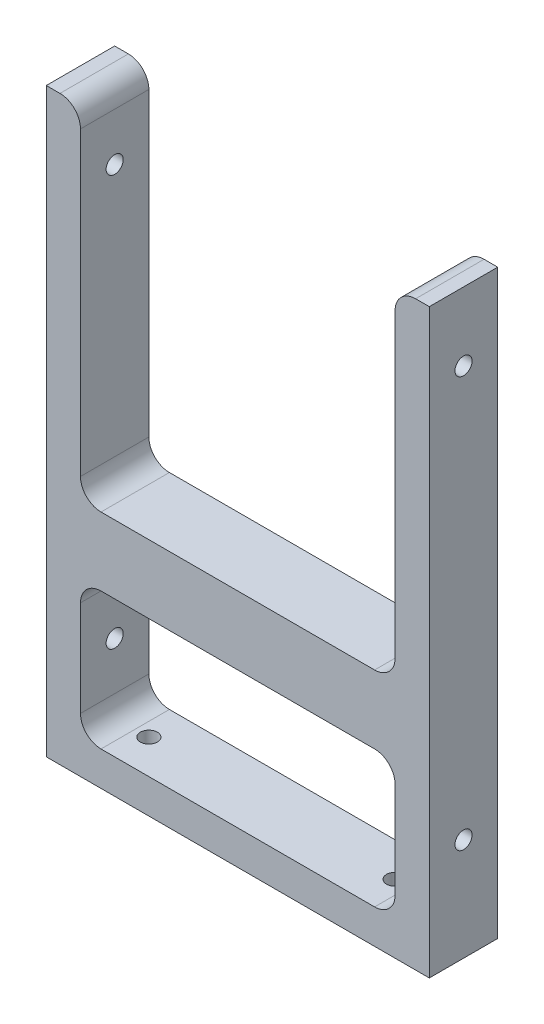
ISO-10303-21;
HEADER;
FILE_DESCRIPTION(('STEP AP214'),'2;1');
FILE_NAME('part.step','',(''),(''),'','','');
FILE_SCHEMA(('AUTOMOTIVE_DESIGN { 1 0 10303 214 1 1 1 1 }'));
ENDSEC;
DATA;
#1=APPLICATION_CONTEXT('core data for automotive mechanical design processes');
#2=APPLICATION_PROTOCOL_DEFINITION('international standard','automotive_design',2000,#1);
#3=PRODUCT_CONTEXT('',#1,'mechanical');
#4=PRODUCT('Part','Part','',(#3));
#5=PRODUCT_RELATED_PRODUCT_CATEGORY('part','',(#4));
#6=PRODUCT_DEFINITION_FORMATION('','',#4);
#7=PRODUCT_DEFINITION_CONTEXT('part definition',#1,'design');
#8=PRODUCT_DEFINITION('design','',#6,#7);
#9=PRODUCT_DEFINITION_SHAPE('','',#8);
#10=(LENGTH_UNIT() NAMED_UNIT(*) SI_UNIT(.MILLI.,.METRE.));
#11=(NAMED_UNIT(*) PLANE_ANGLE_UNIT() SI_UNIT($,.RADIAN.));
#12=(NAMED_UNIT(*) SI_UNIT($,.STERADIAN.) SOLID_ANGLE_UNIT());
#13=UNCERTAINTY_MEASURE_WITH_UNIT(LENGTH_MEASURE(1.E-05),#10,'distance_accuracy_value','');
#14=(GEOMETRIC_REPRESENTATION_CONTEXT(3) GLOBAL_UNCERTAINTY_ASSIGNED_CONTEXT((#13)) GLOBAL_UNIT_ASSIGNED_CONTEXT((#10,
#11,#12)) REPRESENTATION_CONTEXT('',''));
#15=CARTESIAN_POINT('',(0.,0.,0.));
#16=DIRECTION('',(0.,0.,1.));
#17=DIRECTION('',(1.,0.,0.));
#18=AXIS2_PLACEMENT_3D('',#15,#16,#17);
#19=CARTESIAN_POINT('',(0.,0.,10.));
#20=DIRECTION('',(0.,0.,1.));
#21=DIRECTION('',(1.,0.,0.));
#22=AXIS2_PLACEMENT_3D('',#19,#20,#21);
#23=PLANE('',#22);
#24=DIRECTION('',(-1.,0.,0.));
#25=VECTOR('',#24,1.);
#26=CARTESIAN_POINT('',(23.,42.5,10.));
#27=LINE('',#26,#25);
#28=CARTESIAN_POINT('',(28.,42.5,10.));
#29=VERTEX_POINT('',#28);
#30=CARTESIAN_POINT('',(26.,42.5,10.));
#31=VERTEX_POINT('',#30);
#32=EDGE_CURVE('E176',#29,#31,#27,.T.);
#33=ORIENTED_EDGE('',*,*,#32,.T.);
#34=CARTESIAN_POINT('',(26.,39.5,10.));
#35=DIRECTION('',(0.,0.,1.));
#36=DIRECTION('',(1.,0.,0.));
#37=AXIS2_PLACEMENT_3D('',#34,#35,#36);
#38=CIRCLE('',#37,3.);
#39=CARTESIAN_POINT('',(23.,39.5,10.));
#40=VERTEX_POINT('',#39);
#41=EDGE_CURVE('E244',#31,#40,#38,.T.);
#42=ORIENTED_EDGE('',*,*,#41,.T.);
#43=DIRECTION('',(0.,-1.,0.));
#44=VECTOR('',#43,1.);
#45=CARTESIAN_POINT('',(23.,42.5,10.));
#46=LINE('',#45,#44);
#47=CARTESIAN_POINT('',(23.,-4.5,10.));
#48=VERTEX_POINT('',#47);
#49=EDGE_CURVE('E186',#40,#48,#46,.T.);
#50=ORIENTED_EDGE('',*,*,#49,.T.);
#51=CARTESIAN_POINT('',(20.,-4.5,10.));
#52=DIRECTION('',(0.,0.,1.));
#53=DIRECTION('',(1.,0.,0.));
#54=AXIS2_PLACEMENT_3D('',#51,#52,#53);
#55=CIRCLE('',#54,3.);
#56=CARTESIAN_POINT('',(20.,-7.50000000000001,10.));
#57=VERTEX_POINT('',#56);
#58=EDGE_CURVE('E267',#48,#57,#55,.F.);
#59=ORIENTED_EDGE('',*,*,#58,.T.);
#60=DIRECTION('',(-1.,0.,0.));
#61=VECTOR('',#60,1.);
#62=CARTESIAN_POINT('',(-23.,-7.50000000000001,10.));
#63=LINE('',#62,#61);
#64=CARTESIAN_POINT('',(-20.,-7.50000000000001,10.));
#65=VERTEX_POINT('',#64);
#66=EDGE_CURVE('E295',#57,#65,#63,.T.);
#67=ORIENTED_EDGE('',*,*,#66,.T.);
#68=CARTESIAN_POINT('',(-20.,-4.5,10.));
#69=DIRECTION('',(0.,0.,1.));
#70=DIRECTION('',(1.,0.,0.));
#71=AXIS2_PLACEMENT_3D('',#68,#69,#70);
#72=CIRCLE('',#71,3.);
#73=CARTESIAN_POINT('',(-23.,-4.5,10.));
#74=VERTEX_POINT('',#73);
#75=EDGE_CURVE('E11',#65,#74,#72,.F.);
#76=ORIENTED_EDGE('',*,*,#75,.T.);
#77=DIRECTION('',(0.,1.,0.));
#78=VECTOR('',#77,1.);
#79=CARTESIAN_POINT('',(-23.,42.5,10.));
#80=LINE('',#79,#78);
#81=CARTESIAN_POINT('',(-23.,39.5,10.));
#82=VERTEX_POINT('',#81);
#83=EDGE_CURVE('E294',#74,#82,#80,.T.);
#84=ORIENTED_EDGE('',*,*,#83,.T.);
#85=CARTESIAN_POINT('',(-26.,39.5,10.));
#86=DIRECTION('',(0.,0.,1.));
#87=DIRECTION('',(1.,0.,0.));
#88=AXIS2_PLACEMENT_3D('',#85,#86,#87);
#89=CIRCLE('',#88,3.);
#90=CARTESIAN_POINT('',(-26.,42.5,10.));
#91=VERTEX_POINT('',#90);
#92=EDGE_CURVE('E53',#82,#91,#89,.T.);
#93=ORIENTED_EDGE('',*,*,#92,.T.);
#94=DIRECTION('',(-1.,0.,0.));
#95=VECTOR('',#94,1.);
#96=CARTESIAN_POINT('',(-28.,42.5,10.));
#97=LINE('',#96,#95);
#98=CARTESIAN_POINT('',(-28.,42.5,10.));
#99=VERTEX_POINT('',#98);
#100=EDGE_CURVE('E297',#91,#99,#97,.T.);
#101=ORIENTED_EDGE('',*,*,#100,.T.);
#102=DIRECTION('',(0.,-1.,0.));
#103=VECTOR('',#102,1.);
#104=CARTESIAN_POINT('',(-28.,42.5,10.));
#105=LINE('',#104,#103);
#106=CARTESIAN_POINT('',(-28.,-42.5,10.));
#107=VERTEX_POINT('',#106);
#108=EDGE_CURVE('E299',#99,#107,#105,.T.);
#109=ORIENTED_EDGE('',*,*,#108,.T.);
#110=DIRECTION('',(1.,0.,0.));
#111=VECTOR('',#110,1.);
#112=CARTESIAN_POINT('',(-28.,-42.5,10.));
#113=LINE('',#112,#111);
#114=CARTESIAN_POINT('',(28.,-42.5,10.));
#115=VERTEX_POINT('',#114);
#116=EDGE_CURVE('E192',#107,#115,#113,.T.);
#117=ORIENTED_EDGE('',*,*,#116,.T.);
#118=DIRECTION('',(0.,1.,0.));
#119=VECTOR('',#118,1.);
#120=CARTESIAN_POINT('',(28.,42.5,10.));
#121=LINE('',#120,#119);
#122=EDGE_CURVE('E187',#115,#29,#121,.T.);
#123=ORIENTED_EDGE('',*,*,#122,.T.);
#124=EDGE_LOOP('',(#33,#42,#50,#59,#67,#76,#84,#93,#101,#109,#117,#123));
#125=FACE_BOUND('',#124,.T.);
#126=DIRECTION('',(-1.,0.,0.));
#127=VECTOR('',#126,1.);
#128=CARTESIAN_POINT('',(-23.,-17.5,10.));
#129=LINE('',#128,#127);
#130=CARTESIAN_POINT('',(20.,-17.5,10.));
#131=VERTEX_POINT('',#130);
#132=CARTESIAN_POINT('',(-20.,-17.5,10.));
#133=VERTEX_POINT('',#132);
#134=EDGE_CURVE('E357',#131,#133,#129,.T.);
#135=ORIENTED_EDGE('',*,*,#134,.F.);
#136=CARTESIAN_POINT('',(20.,-20.5,10.));
#137=DIRECTION('',(0.,0.,1.));
#138=DIRECTION('',(1.,0.,0.));
#139=AXIS2_PLACEMENT_3D('',#136,#137,#138);
#140=CIRCLE('',#139,3.);
#141=CARTESIAN_POINT('',(23.,-20.5,10.));
#142=VERTEX_POINT('',#141);
#143=EDGE_CURVE('E259',#131,#142,#140,.F.);
#144=ORIENTED_EDGE('',*,*,#143,.T.);
#145=DIRECTION('',(0.,1.,0.));
#146=VECTOR('',#145,1.);
#147=CARTESIAN_POINT('',(23.,-17.5,10.));
#148=LINE('',#147,#146);
#149=CARTESIAN_POINT('',(23.,-34.5,10.));
#150=VERTEX_POINT('',#149);
#151=EDGE_CURVE('E341',#150,#142,#148,.T.);
#152=ORIENTED_EDGE('',*,*,#151,.F.);
#153=CARTESIAN_POINT('',(20.,-34.5,10.));
#154=DIRECTION('',(0.,0.,1.));
#155=DIRECTION('',(1.,0.,0.));
#156=AXIS2_PLACEMENT_3D('',#153,#154,#155);
#157=CIRCLE('',#156,3.);
#158=CARTESIAN_POINT('',(20.,-37.5,10.));
#159=VERTEX_POINT('',#158);
#160=EDGE_CURVE('E263',#150,#159,#157,.F.);
#161=ORIENTED_EDGE('',*,*,#160,.T.);
#162=DIRECTION('',(1.,0.,0.));
#163=VECTOR('',#162,1.);
#164=CARTESIAN_POINT('',(-23.,-37.5,10.));
#165=LINE('',#164,#163);
#166=CARTESIAN_POINT('',(-20.,-37.5,10.));
#167=VERTEX_POINT('',#166);
#168=EDGE_CURVE('E309',#167,#159,#165,.T.);
#169=ORIENTED_EDGE('',*,*,#168,.F.);
#170=CARTESIAN_POINT('',(-20.,-34.5,10.));
#171=DIRECTION('',(0.,0.,1.));
#172=DIRECTION('',(1.,0.,0.));
#173=AXIS2_PLACEMENT_3D('',#170,#171,#172);
#174=CIRCLE('',#173,3.);
#175=CARTESIAN_POINT('',(-23.,-34.5,10.));
#176=VERTEX_POINT('',#175);
#177=EDGE_CURVE('E271',#167,#176,#174,.F.);
#178=ORIENTED_EDGE('',*,*,#177,.T.);
#179=DIRECTION('',(0.,-1.,0.));
#180=VECTOR('',#179,1.);
#181=CARTESIAN_POINT('',(-23.,-17.5,10.));
#182=LINE('',#181,#180);
#183=CARTESIAN_POINT('',(-23.,-20.5,10.));
#184=VERTEX_POINT('',#183);
#185=EDGE_CURVE('E354',#184,#176,#182,.T.);
#186=ORIENTED_EDGE('',*,*,#185,.F.);
#187=CARTESIAN_POINT('',(-20.,-20.5,10.));
#188=DIRECTION('',(0.,0.,1.));
#189=DIRECTION('',(1.,0.,0.));
#190=AXIS2_PLACEMENT_3D('',#187,#188,#189);
#191=CIRCLE('',#190,3.);
#192=EDGE_CURVE('E255',#184,#133,#191,.F.);
#193=ORIENTED_EDGE('',*,*,#192,.T.);
#194=EDGE_LOOP('',(#135,#144,#152,#161,#169,#178,#186,#193));
#195=FACE_BOUND('',#194,.T.);
#196=ADVANCED_FACE('F37',(#125,#195),#23,.T.);
#197=CARTESIAN_POINT('',(0.,0.,0.));
#198=DIRECTION('',(0.,0.,1.));
#199=DIRECTION('',(1.,0.,0.));
#200=AXIS2_PLACEMENT_3D('',#197,#198,#199);
#201=PLANE('',#200);
#202=DIRECTION('',(0.,-1.,0.));
#203=VECTOR('',#202,1.);
#204=CARTESIAN_POINT('',(23.,42.5,0.));
#205=LINE('',#204,#203);
#206=CARTESIAN_POINT('',(23.,39.5,0.));
#207=VERTEX_POINT('',#206);
#208=CARTESIAN_POINT('',(23.,-4.5,0.));
#209=VERTEX_POINT('',#208);
#210=EDGE_CURVE('E290',#207,#209,#205,.T.);
#211=ORIENTED_EDGE('',*,*,#210,.F.);
#212=CARTESIAN_POINT('',(26.,39.5,0.));
#213=DIRECTION('',(0.,0.,1.));
#214=DIRECTION('',(1.,0.,0.));
#215=AXIS2_PLACEMENT_3D('',#212,#213,#214);
#216=CIRCLE('',#215,3.);
#217=CARTESIAN_POINT('',(26.,42.5,0.));
#218=VERTEX_POINT('',#217);
#219=EDGE_CURVE('E240',#207,#218,#216,.F.);
#220=ORIENTED_EDGE('',*,*,#219,.T.);
#221=DIRECTION('',(-1.,0.,0.));
#222=VECTOR('',#221,1.);
#223=CARTESIAN_POINT('',(23.,42.5,0.));
#224=LINE('',#223,#222);
#225=CARTESIAN_POINT('',(28.,42.5,0.));
#226=VERTEX_POINT('',#225);
#227=EDGE_CURVE('E308',#226,#218,#224,.T.);
#228=ORIENTED_EDGE('',*,*,#227,.F.);
#229=DIRECTION('',(0.,1.,0.));
#230=VECTOR('',#229,1.);
#231=CARTESIAN_POINT('',(28.,42.5,0.));
#232=LINE('',#231,#230);
#233=CARTESIAN_POINT('',(28.,-42.5,0.));
#234=VERTEX_POINT('',#233);
#235=EDGE_CURVE('E200',#234,#226,#232,.T.);
#236=ORIENTED_EDGE('',*,*,#235,.F.);
#237=DIRECTION('',(1.,0.,0.));
#238=VECTOR('',#237,1.);
#239=CARTESIAN_POINT('',(-28.,-42.5,0.));
#240=LINE('',#239,#238);
#241=CARTESIAN_POINT('',(-28.,-42.5,0.));
#242=VERTEX_POINT('',#241);
#243=EDGE_CURVE('E196',#242,#234,#240,.T.);
#244=ORIENTED_EDGE('',*,*,#243,.F.);
#245=DIRECTION('',(0.,-1.,0.));
#246=VECTOR('',#245,1.);
#247=CARTESIAN_POINT('',(-28.,42.5,0.));
#248=LINE('',#247,#246);
#249=CARTESIAN_POINT('',(-28.,42.5,0.));
#250=VERTEX_POINT('',#249);
#251=EDGE_CURVE('E316',#250,#242,#248,.T.);
#252=ORIENTED_EDGE('',*,*,#251,.F.);
#253=DIRECTION('',(-1.,0.,0.));
#254=VECTOR('',#253,1.);
#255=CARTESIAN_POINT('',(-28.,42.5,0.));
#256=LINE('',#255,#254);
#257=CARTESIAN_POINT('',(-26.,42.5,0.));
#258=VERTEX_POINT('',#257);
#259=EDGE_CURVE('E314',#258,#250,#256,.T.);
#260=ORIENTED_EDGE('',*,*,#259,.F.);
#261=CARTESIAN_POINT('',(-26.,39.5,0.));
#262=DIRECTION('',(0.,0.,1.));
#263=DIRECTION('',(1.,0.,0.));
#264=AXIS2_PLACEMENT_3D('',#261,#262,#263);
#265=CIRCLE('',#264,3.);
#266=CARTESIAN_POINT('',(-23.,39.5,0.));
#267=VERTEX_POINT('',#266);
#268=EDGE_CURVE('E238',#258,#267,#265,.F.);
#269=ORIENTED_EDGE('',*,*,#268,.T.);
#270=DIRECTION('',(0.,1.,0.));
#271=VECTOR('',#270,1.);
#272=CARTESIAN_POINT('',(-23.,42.5,0.));
#273=LINE('',#272,#271);
#274=CARTESIAN_POINT('',(-23.,-4.5,0.));
#275=VERTEX_POINT('',#274);
#276=EDGE_CURVE('E281',#275,#267,#273,.T.);
#277=ORIENTED_EDGE('',*,*,#276,.F.);
#278=CARTESIAN_POINT('',(-20.,-4.5,0.));
#279=DIRECTION('',(0.,0.,1.));
#280=DIRECTION('',(1.,0.,0.));
#281=AXIS2_PLACEMENT_3D('',#278,#279,#280);
#282=CIRCLE('',#281,3.);
#283=CARTESIAN_POINT('',(-20.,-7.50000000000001,0.));
#284=VERTEX_POINT('',#283);
#285=EDGE_CURVE('E46',#275,#284,#282,.T.);
#286=ORIENTED_EDGE('',*,*,#285,.T.);
#287=DIRECTION('',(-1.,0.,0.));
#288=VECTOR('',#287,1.);
#289=CARTESIAN_POINT('',(-23.,-7.50000000000001,0.));
#290=LINE('',#289,#288);
#291=CARTESIAN_POINT('',(20.,-7.50000000000001,0.));
#292=VERTEX_POINT('',#291);
#293=EDGE_CURVE('E280',#292,#284,#290,.T.);
#294=ORIENTED_EDGE('',*,*,#293,.F.);
#295=CARTESIAN_POINT('',(20.,-4.5,0.));
#296=DIRECTION('',(0.,0.,1.));
#297=DIRECTION('',(1.,0.,0.));
#298=AXIS2_PLACEMENT_3D('',#295,#296,#297);
#299=CIRCLE('',#298,3.);
#300=EDGE_CURVE('E265',#292,#209,#299,.T.);
#301=ORIENTED_EDGE('',*,*,#300,.T.);
#302=EDGE_LOOP('',(#211,#220,#228,#236,#244,#252,#260,#269,#277,#286,#294,#301));
#303=FACE_BOUND('',#302,.T.);
#304=DIRECTION('',(1.,0.,0.));
#305=VECTOR('',#304,1.);
#306=CARTESIAN_POINT('',(-23.,-37.5,0.));
#307=LINE('',#306,#305);
#308=CARTESIAN_POINT('',(-20.,-37.5,0.));
#309=VERTEX_POINT('',#308);
#310=CARTESIAN_POINT('',(20.,-37.5,0.));
#311=VERTEX_POINT('',#310);
#312=EDGE_CURVE('E338',#309,#311,#307,.T.);
#313=ORIENTED_EDGE('',*,*,#312,.T.);
#314=CARTESIAN_POINT('',(20.,-34.5,0.));
#315=DIRECTION('',(0.,0.,1.));
#316=DIRECTION('',(1.,0.,0.));
#317=AXIS2_PLACEMENT_3D('',#314,#315,#316);
#318=CIRCLE('',#317,3.);
#319=CARTESIAN_POINT('',(23.,-34.5,0.));
#320=VERTEX_POINT('',#319);
#321=EDGE_CURVE('E261',#311,#320,#318,.T.);
#322=ORIENTED_EDGE('',*,*,#321,.T.);
#323=DIRECTION('',(0.,1.,0.));
#324=VECTOR('',#323,1.);
#325=CARTESIAN_POINT('',(23.,-17.5,0.));
#326=LINE('',#325,#324);
#327=CARTESIAN_POINT('',(23.,-20.5,0.));
#328=VERTEX_POINT('',#327);
#329=EDGE_CURVE('E348',#320,#328,#326,.T.);
#330=ORIENTED_EDGE('',*,*,#329,.T.);
#331=CARTESIAN_POINT('',(20.,-20.5,0.));
#332=DIRECTION('',(0.,0.,1.));
#333=DIRECTION('',(1.,0.,0.));
#334=AXIS2_PLACEMENT_3D('',#331,#332,#333);
#335=CIRCLE('',#334,3.);
#336=CARTESIAN_POINT('',(20.,-17.5,0.));
#337=VERTEX_POINT('',#336);
#338=EDGE_CURVE('E257',#328,#337,#335,.T.);
#339=ORIENTED_EDGE('',*,*,#338,.T.);
#340=DIRECTION('',(-1.,0.,0.));
#341=VECTOR('',#340,1.);
#342=CARTESIAN_POINT('',(-23.,-17.5,0.));
#343=LINE('',#342,#341);
#344=CARTESIAN_POINT('',(-20.,-17.5,0.));
#345=VERTEX_POINT('',#344);
#346=EDGE_CURVE('E345',#337,#345,#343,.T.);
#347=ORIENTED_EDGE('',*,*,#346,.T.);
#348=CARTESIAN_POINT('',(-20.,-20.5,0.));
#349=DIRECTION('',(0.,0.,1.));
#350=DIRECTION('',(1.,0.,0.));
#351=AXIS2_PLACEMENT_3D('',#348,#349,#350);
#352=CIRCLE('',#351,3.);
#353=CARTESIAN_POINT('',(-23.,-20.5,0.));
#354=VERTEX_POINT('',#353);
#355=EDGE_CURVE('E253',#345,#354,#352,.T.);
#356=ORIENTED_EDGE('',*,*,#355,.T.);
#357=DIRECTION('',(0.,-1.,0.));
#358=VECTOR('',#357,1.);
#359=CARTESIAN_POINT('',(-23.,-17.5,0.));
#360=LINE('',#359,#358);
#361=CARTESIAN_POINT('',(-23.,-34.5,0.));
#362=VERTEX_POINT('',#361);
#363=EDGE_CURVE('E342',#354,#362,#360,.T.);
#364=ORIENTED_EDGE('',*,*,#363,.T.);
#365=CARTESIAN_POINT('',(-20.,-34.5,0.));
#366=DIRECTION('',(0.,0.,1.));
#367=DIRECTION('',(1.,0.,0.));
#368=AXIS2_PLACEMENT_3D('',#365,#366,#367);
#369=CIRCLE('',#368,3.);
#370=EDGE_CURVE('E269',#362,#309,#369,.T.);
#371=ORIENTED_EDGE('',*,*,#370,.T.);
#372=EDGE_LOOP('',(#313,#322,#330,#339,#347,#356,#364,#371));
#373=FACE_BOUND('',#372,.T.);
#374=ADVANCED_FACE('F278',(#303,#373),#201,.F.);
#375=CARTESIAN_POINT('',(28.,42.5,10.));
#376=DIRECTION('',(-1.,0.,0.));
#377=DIRECTION('',(0.,0.,1.));
#378=AXIS2_PLACEMENT_3D('',#375,#376,#377);
#379=PLANE('',#378);
#380=CARTESIAN_POINT('',(28.,32.5,5.00000000000001));
#381=DIRECTION('',(1.,0.,0.));
#382=DIRECTION('',(0.,0.,-1.));
#383=AXIS2_PLACEMENT_3D('',#380,#381,#382);
#384=CIRCLE('',#383,1.24999999999999);
#385=CARTESIAN_POINT('',(28.,32.5,3.75000000000002));
#386=VERTEX_POINT('',#385);
#387=EDGE_CURVE('E391',#386,#386,#384,.T.);
#388=ORIENTED_EDGE('',*,*,#387,.F.);
#389=EDGE_LOOP('',(#388));
#390=FACE_BOUND('',#389,.T.);
#391=CARTESIAN_POINT('',(28.,-27.5,5.));
#392=DIRECTION('',(1.,0.,0.));
#393=DIRECTION('',(0.,0.,-1.));
#394=AXIS2_PLACEMENT_3D('',#391,#392,#393);
#395=CIRCLE('',#394,1.24999999999999);
#396=CARTESIAN_POINT('',(28.,-27.5,3.75000000000001));
#397=VERTEX_POINT('',#396);
#398=EDGE_CURVE('E379',#397,#397,#395,.T.);
#399=ORIENTED_EDGE('',*,*,#398,.F.);
#400=EDGE_LOOP('',(#399));
#401=FACE_BOUND('',#400,.T.);
#402=ORIENTED_EDGE('',*,*,#235,.T.);
#403=DIRECTION('',(0.,0.,-1.));
#404=VECTOR('',#403,1.);
#405=CARTESIAN_POINT('',(28.,42.5,10.));
#406=LINE('',#405,#404);
#407=EDGE_CURVE('E181',#29,#226,#406,.T.);
#408=ORIENTED_EDGE('',*,*,#407,.F.);
#409=ORIENTED_EDGE('',*,*,#122,.F.);
#410=DIRECTION('',(0.,0.,-1.));
#411=VECTOR('',#410,1.);
#412=CARTESIAN_POINT('',(28.,-42.5,10.));
#413=LINE('',#412,#411);
#414=EDGE_CURVE('E306',#115,#234,#413,.T.);
#415=ORIENTED_EDGE('',*,*,#414,.T.);
#416=EDGE_LOOP('',(#402,#408,#409,#415));
#417=FACE_BOUND('',#416,.T.);
#418=ADVANCED_FACE('F198',(#390,#401,#417),#379,.F.);
#419=CARTESIAN_POINT('',(23.,42.5,10.));
#420=DIRECTION('',(0.,-1.,0.));
#421=DIRECTION('',(0.,0.,-1.));
#422=AXIS2_PLACEMENT_3D('',#419,#420,#421);
#423=PLANE('',#422);
#424=ORIENTED_EDGE('',*,*,#227,.T.);
#425=DIRECTION('',(0.,0.,-1.));
#426=VECTOR('',#425,1.);
#427=CARTESIAN_POINT('',(26.,42.5,10.));
#428=LINE('',#427,#426);
#429=EDGE_CURVE('E184',#218,#31,#428,.F.);
#430=ORIENTED_EDGE('',*,*,#429,.T.);
#431=ORIENTED_EDGE('',*,*,#32,.F.);
#432=ORIENTED_EDGE('',*,*,#407,.T.);
#433=EDGE_LOOP('',(#424,#430,#431,#432));
#434=FACE_BOUND('',#433,.T.);
#435=ADVANCED_FACE('F179',(#434),#423,.F.);
#436=CARTESIAN_POINT('',(23.,42.5,10.));
#437=DIRECTION('',(1.,0.,0.));
#438=DIRECTION('',(0.,1.,0.));
#439=AXIS2_PLACEMENT_3D('',#436,#437,#438);
#440=PLANE('',#439);
#441=CARTESIAN_POINT('',(23.,32.5,5.00000000000001));
#442=DIRECTION('',(1.,0.,0.));
#443=DIRECTION('',(0.,1.,0.));
#444=AXIS2_PLACEMENT_3D('',#441,#442,#443);
#445=CIRCLE('',#444,1.24999999999999);
#446=CARTESIAN_POINT('',(23.,33.75,5.00000000000001));
#447=VERTEX_POINT('',#446);
#448=EDGE_CURVE('E382',#447,#447,#445,.T.);
#449=ORIENTED_EDGE('',*,*,#448,.T.);
#450=EDGE_LOOP('',(#449));
#451=FACE_BOUND('',#450,.T.);
#452=ORIENTED_EDGE('',*,*,#210,.T.);
#453=DIRECTION('',(0.,0.,-1.));
#454=VECTOR('',#453,1.);
#455=CARTESIAN_POINT('',(23.,-4.5,10.));
#456=LINE('',#455,#454);
#457=EDGE_CURVE('E236',#209,#48,#456,.F.);
#458=ORIENTED_EDGE('',*,*,#457,.T.);
#459=ORIENTED_EDGE('',*,*,#49,.F.);
#460=DIRECTION('',(0.,0.,-1.));
#461=VECTOR('',#460,1.);
#462=CARTESIAN_POINT('',(23.,39.5,10.));
#463=LINE('',#462,#461);
#464=EDGE_CURVE('E233',#40,#207,#463,.T.);
#465=ORIENTED_EDGE('',*,*,#464,.T.);
#466=EDGE_LOOP('',(#452,#458,#459,#465));
#467=FACE_BOUND('',#466,.T.);
#468=ADVANCED_FACE('F335',(#451,#467),#440,.F.);
#469=CARTESIAN_POINT('',(-23.,-7.50000000000001,10.));
#470=DIRECTION('',(0.,-1.,0.));
#471=DIRECTION('',(0.,0.,-1.));
#472=AXIS2_PLACEMENT_3D('',#469,#470,#471);
#473=PLANE('',#472);
#474=ORIENTED_EDGE('',*,*,#66,.F.);
#475=DIRECTION('',(0.,0.,-1.));
#476=VECTOR('',#475,1.);
#477=CARTESIAN_POINT('',(20.,-7.50000000000001,0.));
#478=LINE('',#477,#476);
#479=EDGE_CURVE('E230',#57,#292,#478,.T.);
#480=ORIENTED_EDGE('',*,*,#479,.T.);
#481=ORIENTED_EDGE('',*,*,#293,.T.);
#482=DIRECTION('',(0.,0.,-1.));
#483=VECTOR('',#482,1.);
#484=CARTESIAN_POINT('',(-20.,-7.50000000000001,10.));
#485=LINE('',#484,#483);
#486=EDGE_CURVE('E228',#284,#65,#485,.F.);
#487=ORIENTED_EDGE('',*,*,#486,.T.);
#488=EDGE_LOOP('',(#474,#480,#481,#487));
#489=FACE_BOUND('',#488,.T.);
#490=ADVANCED_FACE('F287',(#489),#473,.F.);
#491=CARTESIAN_POINT('',(-23.,42.5,10.));
#492=DIRECTION('',(-1.,0.,0.));
#493=DIRECTION('',(0.,-1.,0.));
#494=AXIS2_PLACEMENT_3D('',#491,#492,#493);
#495=PLANE('',#494);
#496=CARTESIAN_POINT('',(-23.,32.5,5.00000000000001));
#497=DIRECTION('',(-1.,0.,0.));
#498=DIRECTION('',(0.,-1.,0.));
#499=AXIS2_PLACEMENT_3D('',#496,#497,#498);
#500=CIRCLE('',#499,1.24999999999999);
#501=CARTESIAN_POINT('',(-23.,31.25,5.00000000000001));
#502=VERTEX_POINT('',#501);
#503=EDGE_CURVE('E385',#502,#502,#500,.T.);
#504=ORIENTED_EDGE('',*,*,#503,.T.);
#505=EDGE_LOOP('',(#504));
#506=FACE_BOUND('',#505,.T.);
#507=ORIENTED_EDGE('',*,*,#83,.F.);
#508=DIRECTION('',(0.,0.,-1.));
#509=VECTOR('',#508,1.);
#510=CARTESIAN_POINT('',(-23.,-4.5,0.));
#511=LINE('',#510,#509);
#512=EDGE_CURVE('E247',#74,#275,#511,.T.);
#513=ORIENTED_EDGE('',*,*,#512,.T.);
#514=ORIENTED_EDGE('',*,*,#276,.T.);
#515=DIRECTION('',(0.,0.,-1.));
#516=VECTOR('',#515,1.);
#517=CARTESIAN_POINT('',(-23.,39.5,10.));
#518=LINE('',#517,#516);
#519=EDGE_CURVE('E61',#267,#82,#518,.F.);
#520=ORIENTED_EDGE('',*,*,#519,.T.);
#521=EDGE_LOOP('',(#507,#513,#514,#520));
#522=FACE_BOUND('',#521,.T.);
#523=ADVANCED_FACE('F296',(#506,#522),#495,.F.);
#524=CARTESIAN_POINT('',(-28.,42.5,10.));
#525=DIRECTION('',(0.,-1.,0.));
#526=DIRECTION('',(0.,0.,-1.));
#527=AXIS2_PLACEMENT_3D('',#524,#525,#526);
#528=PLANE('',#527);
#529=ORIENTED_EDGE('',*,*,#100,.F.);
#530=DIRECTION('',(0.,0.,-1.));
#531=VECTOR('',#530,1.);
#532=CARTESIAN_POINT('',(-26.,42.5,10.));
#533=LINE('',#532,#531);
#534=EDGE_CURVE('E250',#91,#258,#533,.T.);
#535=ORIENTED_EDGE('',*,*,#534,.T.);
#536=ORIENTED_EDGE('',*,*,#259,.T.);
#537=DIRECTION('',(0.,0.,-1.));
#538=VECTOR('',#537,1.);
#539=CARTESIAN_POINT('',(-28.,42.5,10.));
#540=LINE('',#539,#538);
#541=EDGE_CURVE('E202',#99,#250,#540,.T.);
#542=ORIENTED_EDGE('',*,*,#541,.F.);
#543=EDGE_LOOP('',(#529,#535,#536,#542));
#544=FACE_BOUND('',#543,.T.);
#545=ADVANCED_FACE('F434',(#544),#528,.F.);
#546=CARTESIAN_POINT('',(-28.,42.5,10.));
#547=DIRECTION('',(1.,0.,0.));
#548=DIRECTION('',(0.,0.,-1.));
#549=AXIS2_PLACEMENT_3D('',#546,#547,#548);
#550=PLANE('',#549);
#551=CARTESIAN_POINT('',(-28.,32.5,5.00000000000001));
#552=DIRECTION('',(1.,0.,0.));
#553=DIRECTION('',(0.,0.,-1.));
#554=AXIS2_PLACEMENT_3D('',#551,#552,#553);
#555=CIRCLE('',#554,1.24999999999999);
#556=CARTESIAN_POINT('',(-28.,32.5,3.75000000000002));
#557=VERTEX_POINT('',#556);
#558=EDGE_CURVE('E388',#557,#557,#555,.T.);
#559=ORIENTED_EDGE('',*,*,#558,.T.);
#560=EDGE_LOOP('',(#559));
#561=FACE_BOUND('',#560,.T.);
#562=CARTESIAN_POINT('',(-28.,-27.5,5.));
#563=DIRECTION('',(1.,0.,0.));
#564=DIRECTION('',(0.,0.,-1.));
#565=AXIS2_PLACEMENT_3D('',#562,#563,#564);
#566=CIRCLE('',#565,1.24999999999999);
#567=CARTESIAN_POINT('',(-28.,-27.5,3.75000000000001));
#568=VERTEX_POINT('',#567);
#569=EDGE_CURVE('E376',#568,#568,#566,.T.);
#570=ORIENTED_EDGE('',*,*,#569,.T.);
#571=EDGE_LOOP('',(#570));
#572=FACE_BOUND('',#571,.T.);
#573=ORIENTED_EDGE('',*,*,#251,.T.);
#574=DIRECTION('',(0.,0.,-1.));
#575=VECTOR('',#574,1.);
#576=CARTESIAN_POINT('',(-28.,-42.5,10.));
#577=LINE('',#576,#575);
#578=EDGE_CURVE('E207',#107,#242,#577,.T.);
#579=ORIENTED_EDGE('',*,*,#578,.F.);
#580=ORIENTED_EDGE('',*,*,#108,.F.);
#581=ORIENTED_EDGE('',*,*,#541,.T.);
#582=EDGE_LOOP('',(#573,#579,#580,#581));
#583=FACE_BOUND('',#582,.T.);
#584=ADVANCED_FACE('F430',(#561,#572,#583),#550,.F.);
#585=CARTESIAN_POINT('',(-28.,-42.5,10.));
#586=DIRECTION('',(0.,1.,0.));
#587=DIRECTION('',(0.,0.,1.));
#588=AXIS2_PLACEMENT_3D('',#585,#586,#587);
#589=PLANE('',#588);
#590=CARTESIAN_POINT('',(-18.,-42.5,5.));
#591=DIRECTION('',(0.,-1.,0.));
#592=DIRECTION('',(0.,0.,-1.));
#593=AXIS2_PLACEMENT_3D('',#590,#591,#592);
#594=CIRCLE('',#593,1.24999999999999);
#595=CARTESIAN_POINT('',(-18.,-42.5,3.75000000000001));
#596=VERTEX_POINT('',#595);
#597=EDGE_CURVE('E370',#596,#596,#594,.T.);
#598=ORIENTED_EDGE('',*,*,#597,.F.);
#599=EDGE_LOOP('',(#598));
#600=FACE_BOUND('',#599,.T.);
#601=CARTESIAN_POINT('',(18.,-42.5,5.));
#602=DIRECTION('',(0.,-1.,0.));
#603=DIRECTION('',(0.,0.,-1.));
#604=AXIS2_PLACEMENT_3D('',#601,#602,#603);
#605=CIRCLE('',#604,1.24999999999999);
#606=CARTESIAN_POINT('',(18.,-42.5,3.75000000000001));
#607=VERTEX_POINT('',#606);
#608=EDGE_CURVE('E364',#607,#607,#605,.T.);
#609=ORIENTED_EDGE('',*,*,#608,.F.);
#610=EDGE_LOOP('',(#609));
#611=FACE_BOUND('',#610,.T.);
#612=ORIENTED_EDGE('',*,*,#243,.T.);
#613=ORIENTED_EDGE('',*,*,#414,.F.);
#614=ORIENTED_EDGE('',*,*,#116,.F.);
#615=ORIENTED_EDGE('',*,*,#578,.T.);
#616=EDGE_LOOP('',(#612,#613,#614,#615));
#617=FACE_BOUND('',#616,.T.);
#618=ADVANCED_FACE('F323',(#600,#611,#617),#589,.F.);
#619=CARTESIAN_POINT('',(23.,-17.5,10.));
#620=DIRECTION('',(-1.,0.,0.));
#621=DIRECTION('',(0.,0.,1.));
#622=AXIS2_PLACEMENT_3D('',#619,#620,#621);
#623=PLANE('',#622);
#624=CARTESIAN_POINT('',(23.,-27.5,5.));
#625=DIRECTION('',(-1.,0.,0.));
#626=DIRECTION('',(0.,0.,1.));
#627=AXIS2_PLACEMENT_3D('',#624,#625,#626);
#628=CIRCLE('',#627,1.24999999999999);
#629=CARTESIAN_POINT('',(23.,-27.5,6.24999999999999));
#630=VERTEX_POINT('',#629);
#631=EDGE_CURVE('E373',#630,#630,#628,.T.);
#632=ORIENTED_EDGE('',*,*,#631,.F.);
#633=EDGE_LOOP('',(#632));
#634=FACE_BOUND('',#633,.T.);
#635=ORIENTED_EDGE('',*,*,#151,.T.);
#636=DIRECTION('',(0.,0.,-1.));
#637=VECTOR('',#636,1.);
#638=CARTESIAN_POINT('',(23.,-20.5,0.));
#639=LINE('',#638,#637);
#640=EDGE_CURVE('E220',#142,#328,#639,.T.);
#641=ORIENTED_EDGE('',*,*,#640,.T.);
#642=ORIENTED_EDGE('',*,*,#329,.F.);
#643=DIRECTION('',(0.,0.,-1.));
#644=VECTOR('',#643,1.);
#645=CARTESIAN_POINT('',(23.,-34.5,10.));
#646=LINE('',#645,#644);
#647=EDGE_CURVE('E218',#320,#150,#646,.F.);
#648=ORIENTED_EDGE('',*,*,#647,.T.);
#649=EDGE_LOOP('',(#635,#641,#642,#648));
#650=FACE_BOUND('',#649,.T.);
#651=ADVANCED_FACE('F425',(#634,#650),#623,.T.);
#652=CARTESIAN_POINT('',(-23.,-17.5,10.));
#653=DIRECTION('',(0.,-1.,0.));
#654=DIRECTION('',(0.,0.,-1.));
#655=AXIS2_PLACEMENT_3D('',#652,#653,#654);
#656=PLANE('',#655);
#657=ORIENTED_EDGE('',*,*,#134,.T.);
#658=DIRECTION('',(0.,0.,-1.));
#659=VECTOR('',#658,1.);
#660=CARTESIAN_POINT('',(-20.,-17.5,0.));
#661=LINE('',#660,#659);
#662=EDGE_CURVE('E204',#133,#345,#661,.T.);
#663=ORIENTED_EDGE('',*,*,#662,.T.);
#664=ORIENTED_EDGE('',*,*,#346,.F.);
#665=DIRECTION('',(0.,0.,-1.));
#666=VECTOR('',#665,1.);
#667=CARTESIAN_POINT('',(20.,-17.5,10.));
#668=LINE('',#667,#666);
#669=EDGE_CURVE('E201',#337,#131,#668,.F.);
#670=ORIENTED_EDGE('',*,*,#669,.T.);
#671=EDGE_LOOP('',(#657,#663,#664,#670));
#672=FACE_BOUND('',#671,.T.);
#673=ADVANCED_FACE('F495',(#672),#656,.T.);
#674=CARTESIAN_POINT('',(-23.,-17.5,10.));
#675=DIRECTION('',(1.,0.,0.));
#676=DIRECTION('',(0.,0.,-1.));
#677=AXIS2_PLACEMENT_3D('',#674,#675,#676);
#678=PLANE('',#677);
#679=CARTESIAN_POINT('',(-23.,-27.5,5.));
#680=DIRECTION('',(1.,0.,0.));
#681=DIRECTION('',(0.,0.,-1.));
#682=AXIS2_PLACEMENT_3D('',#679,#680,#681);
#683=CIRCLE('',#682,1.24999999999999);
#684=CARTESIAN_POINT('',(-23.,-27.5,3.75000000000001));
#685=VERTEX_POINT('',#684);
#686=EDGE_CURVE('E41',#685,#685,#683,.T.);
#687=ORIENTED_EDGE('',*,*,#686,.F.);
#688=EDGE_LOOP('',(#687));
#689=FACE_BOUND('',#688,.T.);
#690=ORIENTED_EDGE('',*,*,#363,.F.);
#691=DIRECTION('',(0.,0.,-1.));
#692=VECTOR('',#691,1.);
#693=CARTESIAN_POINT('',(-23.,-20.5,10.));
#694=LINE('',#693,#692);
#695=EDGE_CURVE('E216',#354,#184,#694,.F.);
#696=ORIENTED_EDGE('',*,*,#695,.T.);
#697=ORIENTED_EDGE('',*,*,#185,.T.);
#698=DIRECTION('',(0.,0.,-1.));
#699=VECTOR('',#698,1.);
#700=CARTESIAN_POINT('',(-23.,-34.5,0.));
#701=LINE('',#700,#699);
#702=EDGE_CURVE('E213',#176,#362,#701,.T.);
#703=ORIENTED_EDGE('',*,*,#702,.T.);
#704=EDGE_LOOP('',(#690,#696,#697,#703));
#705=FACE_BOUND('',#704,.T.);
#706=ADVANCED_FACE('F492',(#689,#705),#678,.T.);
#707=CARTESIAN_POINT('',(-23.,-37.5,10.));
#708=DIRECTION('',(0.,1.,0.));
#709=DIRECTION('',(0.,0.,1.));
#710=AXIS2_PLACEMENT_3D('',#707,#708,#709);
#711=PLANE('',#710);
#712=CARTESIAN_POINT('',(-18.,-37.5,5.));
#713=DIRECTION('',(0.,1.,0.));
#714=DIRECTION('',(0.,0.,1.));
#715=AXIS2_PLACEMENT_3D('',#712,#713,#714);
#716=CIRCLE('',#715,1.24999999999999);
#717=CARTESIAN_POINT('',(-18.,-37.5,6.24999999999999));
#718=VERTEX_POINT('',#717);
#719=EDGE_CURVE('E367',#718,#718,#716,.T.);
#720=ORIENTED_EDGE('',*,*,#719,.F.);
#721=EDGE_LOOP('',(#720));
#722=FACE_BOUND('',#721,.T.);
#723=CARTESIAN_POINT('',(18.,-37.5,5.));
#724=DIRECTION('',(0.,1.,0.));
#725=DIRECTION('',(0.,0.,1.));
#726=AXIS2_PLACEMENT_3D('',#723,#724,#725);
#727=CIRCLE('',#726,1.24999999999999);
#728=CARTESIAN_POINT('',(18.,-37.5,6.24999999999999));
#729=VERTEX_POINT('',#728);
#730=EDGE_CURVE('E351',#729,#729,#727,.T.);
#731=ORIENTED_EDGE('',*,*,#730,.F.);
#732=EDGE_LOOP('',(#731));
#733=FACE_BOUND('',#732,.T.);
#734=ORIENTED_EDGE('',*,*,#168,.T.);
#735=DIRECTION('',(0.,0.,-1.));
#736=VECTOR('',#735,1.);
#737=CARTESIAN_POINT('',(20.,-37.5,0.));
#738=LINE('',#737,#736);
#739=EDGE_CURVE('E225',#159,#311,#738,.T.);
#740=ORIENTED_EDGE('',*,*,#739,.T.);
#741=ORIENTED_EDGE('',*,*,#312,.F.);
#742=DIRECTION('',(0.,0.,-1.));
#743=VECTOR('',#742,1.);
#744=CARTESIAN_POINT('',(-20.,-37.5,10.));
#745=LINE('',#744,#743);
#746=EDGE_CURVE('E223',#309,#167,#745,.F.);
#747=ORIENTED_EDGE('',*,*,#746,.T.);
#748=EDGE_LOOP('',(#734,#740,#741,#747));
#749=FACE_BOUND('',#748,.T.);
#750=ADVANCED_FACE('F453',(#722,#733,#749),#711,.T.);
#751=CARTESIAN_POINT('',(-20.,-20.5,10.));
#752=DIRECTION('',(0.,0.,1.));
#753=DIRECTION('',(1.,0.,0.));
#754=AXIS2_PLACEMENT_3D('',#751,#752,#753);
#755=CYLINDRICAL_SURFACE('',#754,3.);
#756=ORIENTED_EDGE('',*,*,#192,.F.);
#757=ORIENTED_EDGE('',*,*,#695,.F.);
#758=ORIENTED_EDGE('',*,*,#355,.F.);
#759=ORIENTED_EDGE('',*,*,#662,.F.);
#760=EDGE_LOOP('',(#756,#757,#758,#759));
#761=FACE_BOUND('',#760,.T.);
#762=ADVANCED_FACE('F449',(#761),#755,.F.);
#763=CARTESIAN_POINT('',(20.,-20.5,10.));
#764=DIRECTION('',(0.,0.,1.));
#765=DIRECTION('',(1.,0.,0.));
#766=AXIS2_PLACEMENT_3D('',#763,#764,#765);
#767=CYLINDRICAL_SURFACE('',#766,3.);
#768=ORIENTED_EDGE('',*,*,#143,.F.);
#769=ORIENTED_EDGE('',*,*,#669,.F.);
#770=ORIENTED_EDGE('',*,*,#338,.F.);
#771=ORIENTED_EDGE('',*,*,#640,.F.);
#772=EDGE_LOOP('',(#768,#769,#770,#771));
#773=FACE_BOUND('',#772,.T.);
#774=ADVANCED_FACE('F452',(#773),#767,.F.);
#775=CARTESIAN_POINT('',(20.,-34.5,10.));
#776=DIRECTION('',(0.,0.,1.));
#777=DIRECTION('',(1.,0.,0.));
#778=AXIS2_PLACEMENT_3D('',#775,#776,#777);
#779=CYLINDRICAL_SURFACE('',#778,3.);
#780=ORIENTED_EDGE('',*,*,#160,.F.);
#781=ORIENTED_EDGE('',*,*,#647,.F.);
#782=ORIENTED_EDGE('',*,*,#321,.F.);
#783=ORIENTED_EDGE('',*,*,#739,.F.);
#784=EDGE_LOOP('',(#780,#781,#782,#783));
#785=FACE_BOUND('',#784,.T.);
#786=ADVANCED_FACE('F457',(#785),#779,.F.);
#787=CARTESIAN_POINT('',(20.,-4.5,10.));
#788=DIRECTION('',(0.,0.,1.));
#789=DIRECTION('',(1.,0.,0.));
#790=AXIS2_PLACEMENT_3D('',#787,#788,#789);
#791=CYLINDRICAL_SURFACE('',#790,3.);
#792=ORIENTED_EDGE('',*,*,#58,.F.);
#793=ORIENTED_EDGE('',*,*,#457,.F.);
#794=ORIENTED_EDGE('',*,*,#300,.F.);
#795=ORIENTED_EDGE('',*,*,#479,.F.);
#796=EDGE_LOOP('',(#792,#793,#794,#795));
#797=FACE_BOUND('',#796,.T.);
#798=ADVANCED_FACE('F461',(#797),#791,.F.);
#799=CARTESIAN_POINT('',(26.,39.5,10.));
#800=DIRECTION('',(0.,0.,-1.));
#801=DIRECTION('',(-1.,0.,0.));
#802=AXIS2_PLACEMENT_3D('',#799,#800,#801);
#803=CYLINDRICAL_SURFACE('',#802,3.);
#804=ORIENTED_EDGE('',*,*,#41,.F.);
#805=ORIENTED_EDGE('',*,*,#429,.F.);
#806=ORIENTED_EDGE('',*,*,#219,.F.);
#807=ORIENTED_EDGE('',*,*,#464,.F.);
#808=EDGE_LOOP('',(#804,#805,#806,#807));
#809=FACE_BOUND('',#808,.T.);
#810=ADVANCED_FACE('F329',(#809),#803,.T.);
#811=CARTESIAN_POINT('',(-20.,-34.5,10.));
#812=DIRECTION('',(0.,0.,1.));
#813=DIRECTION('',(1.,0.,0.));
#814=AXIS2_PLACEMENT_3D('',#811,#812,#813);
#815=CYLINDRICAL_SURFACE('',#814,3.);
#816=ORIENTED_EDGE('',*,*,#177,.F.);
#817=ORIENTED_EDGE('',*,*,#746,.F.);
#818=ORIENTED_EDGE('',*,*,#370,.F.);
#819=ORIENTED_EDGE('',*,*,#702,.F.);
#820=EDGE_LOOP('',(#816,#817,#818,#819));
#821=FACE_BOUND('',#820,.T.);
#822=ADVANCED_FACE('F468',(#821),#815,.F.);
#823=CARTESIAN_POINT('',(-20.,-4.5,10.));
#824=DIRECTION('',(0.,0.,1.));
#825=DIRECTION('',(1.,0.,0.));
#826=AXIS2_PLACEMENT_3D('',#823,#824,#825);
#827=CYLINDRICAL_SURFACE('',#826,3.);
#828=ORIENTED_EDGE('',*,*,#75,.F.);
#829=ORIENTED_EDGE('',*,*,#486,.F.);
#830=ORIENTED_EDGE('',*,*,#285,.F.);
#831=ORIENTED_EDGE('',*,*,#512,.F.);
#832=EDGE_LOOP('',(#828,#829,#830,#831));
#833=FACE_BOUND('',#832,.T.);
#834=ADVANCED_FACE('F293',(#833),#827,.F.);
#835=CARTESIAN_POINT('',(-26.,39.5,10.));
#836=DIRECTION('',(0.,0.,-1.));
#837=DIRECTION('',(-1.,0.,0.));
#838=AXIS2_PLACEMENT_3D('',#835,#836,#837);
#839=CYLINDRICAL_SURFACE('',#838,3.);
#840=ORIENTED_EDGE('',*,*,#92,.F.);
#841=ORIENTED_EDGE('',*,*,#519,.F.);
#842=ORIENTED_EDGE('',*,*,#268,.F.);
#843=ORIENTED_EDGE('',*,*,#534,.F.);
#844=EDGE_LOOP('',(#840,#841,#842,#843));
#845=FACE_BOUND('',#844,.T.);
#846=ADVANCED_FACE('F39',(#845),#839,.T.);
#847=CARTESIAN_POINT('',(18.,-42.5,5.));
#848=DIRECTION('',(0.,-1.,0.));
#849=DIRECTION('',(0.,0.,-1.));
#850=AXIS2_PLACEMENT_3D('',#847,#848,#849);
#851=CYLINDRICAL_SURFACE('',#850,1.24999999999999);
#852=ORIENTED_EDGE('',*,*,#608,.T.);
#853=EDGE_LOOP('',(#852));
#854=FACE_BOUND('',#853,.T.);
#855=ORIENTED_EDGE('',*,*,#730,.T.);
#856=EDGE_LOOP('',(#855));
#857=FACE_BOUND('',#856,.T.);
#858=ADVANCED_FACE('F475',(#854,#857),#851,.F.);
#859=CARTESIAN_POINT('',(-18.,-42.5,5.));
#860=DIRECTION('',(0.,-1.,0.));
#861=DIRECTION('',(0.,0.,-1.));
#862=AXIS2_PLACEMENT_3D('',#859,#860,#861);
#863=CYLINDRICAL_SURFACE('',#862,1.24999999999999);
#864=ORIENTED_EDGE('',*,*,#597,.T.);
#865=EDGE_LOOP('',(#864));
#866=FACE_BOUND('',#865,.T.);
#867=ORIENTED_EDGE('',*,*,#719,.T.);
#868=EDGE_LOOP('',(#867));
#869=FACE_BOUND('',#868,.T.);
#870=ADVANCED_FACE('F415',(#866,#869),#863,.F.);
#871=CARTESIAN_POINT('',(28.,-27.5,5.));
#872=DIRECTION('',(1.,0.,0.));
#873=DIRECTION('',(0.,0.,-1.));
#874=AXIS2_PLACEMENT_3D('',#871,#872,#873);
#875=CYLINDRICAL_SURFACE('',#874,1.24999999999999);
#876=ORIENTED_EDGE('',*,*,#686,.T.);
#877=EDGE_LOOP('',(#876));
#878=FACE_BOUND('',#877,.T.);
#879=ORIENTED_EDGE('',*,*,#569,.F.);
#880=EDGE_LOOP('',(#879));
#881=FACE_BOUND('',#880,.T.);
#882=ADVANCED_FACE('F406',(#878,#881),#875,.F.);
#883=ORIENTED_EDGE('',*,*,#631,.T.);
#884=EDGE_LOOP('',(#883));
#885=FACE_BOUND('',#884,.T.);
#886=ORIENTED_EDGE('',*,*,#398,.T.);
#887=EDGE_LOOP('',(#886));
#888=FACE_BOUND('',#887,.T.);
#889=ADVANCED_FACE('F403',(#885,#888),#875,.F.);
#890=CARTESIAN_POINT('',(28.,32.5,5.00000000000001));
#891=DIRECTION('',(1.,0.,0.));
#892=DIRECTION('',(0.,0.,-1.));
#893=AXIS2_PLACEMENT_3D('',#890,#891,#892);
#894=CYLINDRICAL_SURFACE('',#893,1.24999999999999);
#895=ORIENTED_EDGE('',*,*,#558,.F.);
#896=EDGE_LOOP('',(#895));
#897=FACE_BOUND('',#896,.T.);
#898=ORIENTED_EDGE('',*,*,#503,.F.);
#899=EDGE_LOOP('',(#898));
#900=FACE_BOUND('',#899,.T.);
#901=ADVANCED_FACE('F405',(#897,#900),#894,.F.);
#902=ORIENTED_EDGE('',*,*,#387,.T.);
#903=EDGE_LOOP('',(#902));
#904=FACE_BOUND('',#903,.T.);
#905=ORIENTED_EDGE('',*,*,#448,.F.);
#906=EDGE_LOOP('',(#905));
#907=FACE_BOUND('',#906,.T.);
#908=ADVANCED_FACE('F395',(#904,#907),#894,.F.);
#909=CLOSED_SHELL('',(#196,#374,#418,#435,#468,#490,#523,#545,#584,#618,#651,#673,#706,#750,
#762,#774,#786,#798,#810,#822,#834,#846,#858,#870,#882,#889,#901,#908));
#910=MANIFOLD_SOLID_BREP('B2',#909);
#911=ADVANCED_BREP_SHAPE_REPRESENTATION('',(#18,#910),#14);
#912=SHAPE_DEFINITION_REPRESENTATION(#9,#911);
ENDSEC;
END-ISO-10303-21;
